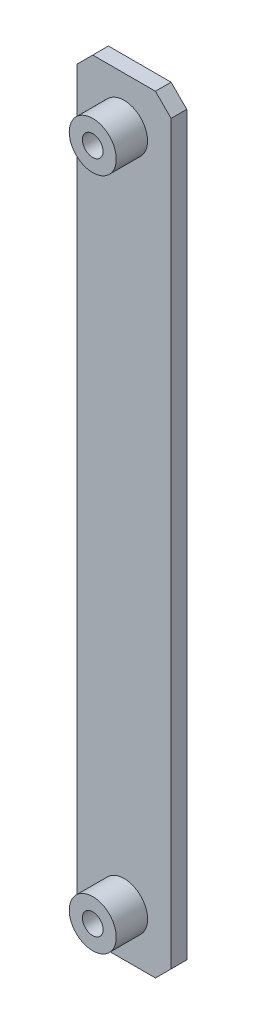
ISO-10303-21;
HEADER;
FILE_DESCRIPTION(('STEP AP214'),'2;1');
FILE_NAME('part.step','',(''),(''),'','','');
FILE_SCHEMA(('AUTOMOTIVE_DESIGN { 1 0 10303 214 1 1 1 1 }'));
ENDSEC;
DATA;
#1=APPLICATION_CONTEXT('core data for automotive mechanical design processes');
#2=APPLICATION_PROTOCOL_DEFINITION('international standard','automotive_design',2000,#1);
#3=PRODUCT_CONTEXT('',#1,'mechanical');
#4=PRODUCT('Part','Part','',(#3));
#5=PRODUCT_RELATED_PRODUCT_CATEGORY('part','',(#4));
#6=PRODUCT_DEFINITION_FORMATION('','',#4);
#7=PRODUCT_DEFINITION_CONTEXT('part definition',#1,'design');
#8=PRODUCT_DEFINITION('design','',#6,#7);
#9=PRODUCT_DEFINITION_SHAPE('','',#8);
#10=(LENGTH_UNIT() NAMED_UNIT(*) SI_UNIT(.MILLI.,.METRE.));
#11=(NAMED_UNIT(*) PLANE_ANGLE_UNIT() SI_UNIT($,.RADIAN.));
#12=(NAMED_UNIT(*) SI_UNIT($,.STERADIAN.) SOLID_ANGLE_UNIT());
#13=UNCERTAINTY_MEASURE_WITH_UNIT(LENGTH_MEASURE(1.E-05),#10,'distance_accuracy_value','');
#14=(GEOMETRIC_REPRESENTATION_CONTEXT(3) GLOBAL_UNCERTAINTY_ASSIGNED_CONTEXT((#13)) GLOBAL_UNIT_ASSIGNED_CONTEXT((#10,
#11,#12)) REPRESENTATION_CONTEXT('',''));
#15=CARTESIAN_POINT('',(0.,0.,0.));
#16=DIRECTION('',(0.,0.,1.));
#17=DIRECTION('',(1.,0.,0.));
#18=AXIS2_PLACEMENT_3D('',#15,#16,#17);
#19=CARTESIAN_POINT('',(0.,0.,1.5875));
#20=DIRECTION('',(0.,0.,1.));
#21=DIRECTION('',(1.,0.,0.));
#22=AXIS2_PLACEMENT_3D('',#19,#20,#21);
#23=PLANE('',#22);
#24=CARTESIAN_POINT('',(-4.7625,4.7625,1.5875));
#25=DIRECTION('',(0.,0.,1.));
#26=DIRECTION('',(1.,0.,0.));
#27=AXIS2_PLACEMENT_3D('',#24,#25,#26);
#28=CIRCLE('',#27,2.38125);
#29=CARTESIAN_POINT('',(-2.38125,4.7625,1.5875));
#30=VERTEX_POINT('',#29);
#31=EDGE_CURVE('E197',#30,#30,#28,.T.);
#32=ORIENTED_EDGE('',*,*,#31,.F.);
#33=EDGE_LOOP('',(#32));
#34=FACE_BOUND('',#33,.T.);
#35=DIRECTION('',(0.,1.,0.));
#36=VECTOR('',#35,1.);
#37=CARTESIAN_POINT('',(0.,0.,1.5875));
#38=LINE('',#37,#36);
#39=CARTESIAN_POINT('',(0.,1.5875,1.5875));
#40=VERTEX_POINT('',#39);
#41=CARTESIAN_POINT('',(0.,76.2,1.5875));
#42=VERTEX_POINT('',#41);
#43=EDGE_CURVE('E138',#40,#42,#38,.T.);
#44=ORIENTED_EDGE('',*,*,#43,.T.);
#45=DIRECTION('',(0.707106781186549,-0.707106781186546,0.));
#46=VECTOR('',#45,1.);
#47=CARTESIAN_POINT('',(38.1,38.1000000000002,1.5875));
#48=LINE('',#47,#46);
#49=CARTESIAN_POINT('',(-1.58750000000001,77.7875,1.5875));
#50=VERTEX_POINT('',#49);
#51=EDGE_CURVE('E153',#42,#50,#48,.F.);
#52=ORIENTED_EDGE('',*,*,#51,.T.);
#53=DIRECTION('',(-1.,0.,0.));
#54=VECTOR('',#53,1.);
#55=CARTESIAN_POINT('',(0.,77.7875,1.5875));
#56=LINE('',#55,#54);
#57=CARTESIAN_POINT('',(-7.9375,77.7875,1.5875));
#58=VERTEX_POINT('',#57);
#59=EDGE_CURVE('E121',#50,#58,#56,.T.);
#60=ORIENTED_EDGE('',*,*,#59,.T.);
#61=DIRECTION('',(0.707106781186548,0.707106781186548,0.));
#62=VECTOR('',#61,1.);
#63=CARTESIAN_POINT('',(-42.8625,42.8625,1.5875));
#64=LINE('',#63,#62);
#65=CARTESIAN_POINT('',(-9.525,76.2,1.5875));
#66=VERTEX_POINT('',#65);
#67=EDGE_CURVE('E151',#58,#66,#64,.F.);
#68=ORIENTED_EDGE('',*,*,#67,.T.);
#69=DIRECTION('',(0.,-1.,0.));
#70=VECTOR('',#69,1.);
#71=CARTESIAN_POINT('',(-9.52500000000001,0.,1.5875));
#72=LINE('',#71,#70);
#73=CARTESIAN_POINT('',(-9.52500000000001,1.58749999999998,1.5875));
#74=VERTEX_POINT('',#73);
#75=EDGE_CURVE('E173',#66,#74,#72,.T.);
#76=ORIENTED_EDGE('',*,*,#75,.T.);
#77=DIRECTION('',(-0.707106781186548,0.707106781186548,0.));
#78=VECTOR('',#77,1.);
#79=CARTESIAN_POINT('',(-3.96875000000001,-3.96875000000001,1.5875));
#80=LINE('',#79,#78);
#81=CARTESIAN_POINT('',(-7.93750000000002,0.,1.5875));
#82=VERTEX_POINT('',#81);
#83=EDGE_CURVE('E56',#74,#82,#80,.F.);
#84=ORIENTED_EDGE('',*,*,#83,.T.);
#85=DIRECTION('',(1.,0.,0.));
#86=VECTOR('',#85,1.);
#87=CARTESIAN_POINT('',(0.,0.,1.5875));
#88=LINE('',#87,#86);
#89=CARTESIAN_POINT('',(-1.58750000000001,0.,1.5875));
#90=VERTEX_POINT('',#89);
#91=EDGE_CURVE('E139',#82,#90,#88,.T.);
#92=ORIENTED_EDGE('',*,*,#91,.T.);
#93=DIRECTION('',(-0.707106781186549,-0.707106781186546,0.));
#94=VECTOR('',#93,1.);
#95=CARTESIAN_POINT('',(-0.793749999999999,0.793750000000003,1.5875));
#96=LINE('',#95,#94);
#97=EDGE_CURVE('E149',#90,#40,#96,.F.);
#98=ORIENTED_EDGE('',*,*,#97,.T.);
#99=EDGE_LOOP('',(#44,#52,#60,#68,#76,#84,#92,#98));
#100=FACE_BOUND('',#99,.T.);
#101=CARTESIAN_POINT('',(-4.7625,73.025,1.5875));
#102=DIRECTION('',(0.,0.,1.));
#103=DIRECTION('',(-1.,0.,0.));
#104=AXIS2_PLACEMENT_3D('',#101,#102,#103);
#105=CIRCLE('',#104,2.38125);
#106=CARTESIAN_POINT('',(-7.14375000000001,73.025,1.5875));
#107=VERTEX_POINT('',#106);
#108=EDGE_CURVE('E184',#107,#107,#105,.T.);
#109=ORIENTED_EDGE('',*,*,#108,.F.);
#110=EDGE_LOOP('',(#109));
#111=FACE_BOUND('',#110,.T.);
#112=ADVANCED_FACE('F35',(#34,#100,#111),#23,.T.);
#113=CARTESIAN_POINT('',(0.,0.,1.5875));
#114=DIRECTION('',(-1.,0.,0.));
#115=DIRECTION('',(0.,0.,1.));
#116=AXIS2_PLACEMENT_3D('',#113,#114,#115);
#117=PLANE('',#116);
#118=DIRECTION('',(0.,1.,0.));
#119=VECTOR('',#118,1.);
#120=CARTESIAN_POINT('',(0.,0.,0.));
#121=LINE('',#120,#119);
#122=CARTESIAN_POINT('',(0.,1.5875,0.));
#123=VERTEX_POINT('',#122);
#124=CARTESIAN_POINT('',(0.,76.2,0.));
#125=VERTEX_POINT('',#124);
#126=EDGE_CURVE('E128',#123,#125,#121,.T.);
#127=ORIENTED_EDGE('',*,*,#126,.T.);
#128=DIRECTION('',(0.,0.,1.));
#129=VECTOR('',#128,1.);
#130=CARTESIAN_POINT('',(0.,76.2,1.5875));
#131=LINE('',#130,#129);
#132=EDGE_CURVE('E106',#125,#42,#131,.T.);
#133=ORIENTED_EDGE('',*,*,#132,.T.);
#134=ORIENTED_EDGE('',*,*,#43,.F.);
#135=DIRECTION('',(0.,0.,-1.));
#136=VECTOR('',#135,1.);
#137=CARTESIAN_POINT('',(0.,1.5875,1.5875));
#138=LINE('',#137,#136);
#139=EDGE_CURVE('E111',#40,#123,#138,.T.);
#140=ORIENTED_EDGE('',*,*,#139,.T.);
#141=EDGE_LOOP('',(#127,#133,#134,#140));
#142=FACE_BOUND('',#141,.T.);
#143=ADVANCED_FACE('F170',(#142),#117,.F.);
#144=CARTESIAN_POINT('',(0.,77.7875,1.5875));
#145=DIRECTION('',(0.,-1.,0.));
#146=DIRECTION('',(1.,0.,0.));
#147=AXIS2_PLACEMENT_3D('',#144,#145,#146);
#148=PLANE('',#147);
#149=ORIENTED_EDGE('',*,*,#59,.F.);
#150=DIRECTION('',(0.,0.,-1.));
#151=VECTOR('',#150,1.);
#152=CARTESIAN_POINT('',(-1.58750000000001,77.7875,1.5875));
#153=LINE('',#152,#151);
#154=CARTESIAN_POINT('',(-1.58750000000001,77.7875,0.));
#155=VERTEX_POINT('',#154);
#156=EDGE_CURVE('E105',#50,#155,#153,.T.);
#157=ORIENTED_EDGE('',*,*,#156,.T.);
#158=DIRECTION('',(-1.,0.,0.));
#159=VECTOR('',#158,1.);
#160=CARTESIAN_POINT('',(0.,77.7875,0.));
#161=LINE('',#160,#159);
#162=CARTESIAN_POINT('',(-7.9375,77.7875,0.));
#163=VERTEX_POINT('',#162);
#164=EDGE_CURVE('E118',#155,#163,#161,.T.);
#165=ORIENTED_EDGE('',*,*,#164,.T.);
#166=DIRECTION('',(0.,0.,1.));
#167=VECTOR('',#166,1.);
#168=CARTESIAN_POINT('',(-7.93750000000001,77.7875,1.5875));
#169=LINE('',#168,#167);
#170=EDGE_CURVE('E123',#163,#58,#169,.T.);
#171=ORIENTED_EDGE('',*,*,#170,.T.);
#172=EDGE_LOOP('',(#149,#157,#165,#171));
#173=FACE_BOUND('',#172,.T.);
#174=ADVANCED_FACE('F117',(#173),#148,.F.);
#175=CARTESIAN_POINT('',(-9.52500000000001,0.,1.5875));
#176=DIRECTION('',(1.,0.,0.));
#177=DIRECTION('',(0.,1.,0.));
#178=AXIS2_PLACEMENT_3D('',#175,#176,#177);
#179=PLANE('',#178);
#180=ORIENTED_EDGE('',*,*,#75,.F.);
#181=DIRECTION('',(0.,0.,-1.));
#182=VECTOR('',#181,1.);
#183=CARTESIAN_POINT('',(-9.525,76.2,1.5875));
#184=LINE('',#183,#182);
#185=CARTESIAN_POINT('',(-9.525,76.2,0.));
#186=VERTEX_POINT('',#185);
#187=EDGE_CURVE('E157',#66,#186,#184,.T.);
#188=ORIENTED_EDGE('',*,*,#187,.T.);
#189=DIRECTION('',(0.,-1.,0.));
#190=VECTOR('',#189,1.);
#191=CARTESIAN_POINT('',(-9.52500000000001,0.,0.));
#192=LINE('',#191,#190);
#193=CARTESIAN_POINT('',(-9.52500000000001,1.58749999999998,0.));
#194=VERTEX_POINT('',#193);
#195=EDGE_CURVE('E127',#186,#194,#192,.T.);
#196=ORIENTED_EDGE('',*,*,#195,.T.);
#197=DIRECTION('',(0.,0.,1.));
#198=VECTOR('',#197,1.);
#199=CARTESIAN_POINT('',(-9.52500000000001,1.58749999999998,1.5875));
#200=LINE('',#199,#198);
#201=EDGE_CURVE('E155',#194,#74,#200,.T.);
#202=ORIENTED_EDGE('',*,*,#201,.T.);
#203=EDGE_LOOP('',(#180,#188,#196,#202));
#204=FACE_BOUND('',#203,.T.);
#205=ADVANCED_FACE('F243',(#204),#179,.F.);
#206=CARTESIAN_POINT('',(0.,0.,1.5875));
#207=DIRECTION('',(0.,1.,0.));
#208=DIRECTION('',(-1.,0.,0.));
#209=AXIS2_PLACEMENT_3D('',#206,#207,#208);
#210=PLANE('',#209);
#211=DIRECTION('',(1.,0.,0.));
#212=VECTOR('',#211,1.);
#213=CARTESIAN_POINT('',(0.,0.,0.));
#214=LINE('',#213,#212);
#215=CARTESIAN_POINT('',(-7.93750000000002,0.,0.));
#216=VERTEX_POINT('',#215);
#217=CARTESIAN_POINT('',(-1.58750000000001,0.,0.));
#218=VERTEX_POINT('',#217);
#219=EDGE_CURVE('E131',#216,#218,#214,.T.);
#220=ORIENTED_EDGE('',*,*,#219,.T.);
#221=DIRECTION('',(0.,0.,1.));
#222=VECTOR('',#221,1.);
#223=CARTESIAN_POINT('',(-1.58750000000001,0.,1.5875));
#224=LINE('',#223,#222);
#225=EDGE_CURVE('E11',#218,#90,#224,.T.);
#226=ORIENTED_EDGE('',*,*,#225,.T.);
#227=ORIENTED_EDGE('',*,*,#91,.F.);
#228=DIRECTION('',(0.,0.,-1.));
#229=VECTOR('',#228,1.);
#230=CARTESIAN_POINT('',(-7.93750000000002,0.,1.5875));
#231=LINE('',#230,#229);
#232=EDGE_CURVE('E44',#82,#216,#231,.T.);
#233=ORIENTED_EDGE('',*,*,#232,.T.);
#234=EDGE_LOOP('',(#220,#226,#227,#233));
#235=FACE_BOUND('',#234,.T.);
#236=ADVANCED_FACE('F162',(#235),#210,.F.);
#237=CARTESIAN_POINT('',(0.,0.,0.));
#238=DIRECTION('',(0.,0.,1.));
#239=DIRECTION('',(1.,0.,0.));
#240=AXIS2_PLACEMENT_3D('',#237,#238,#239);
#241=PLANE('',#240);
#242=CARTESIAN_POINT('',(-4.7625,4.7625,0.));
#243=DIRECTION('',(0.,0.,1.));
#244=DIRECTION('',(1.,0.,0.));
#245=AXIS2_PLACEMENT_3D('',#242,#243,#244);
#246=CIRCLE('',#245,1.04775);
#247=CARTESIAN_POINT('',(-3.71475,4.7625,0.));
#248=VERTEX_POINT('',#247);
#249=EDGE_CURVE('E201',#248,#248,#246,.T.);
#250=ORIENTED_EDGE('',*,*,#249,.T.);
#251=EDGE_LOOP('',(#250));
#252=FACE_BOUND('',#251,.T.);
#253=CARTESIAN_POINT('',(-4.7625,73.025,0.));
#254=DIRECTION('',(0.,0.,1.));
#255=DIRECTION('',(1.,0.,0.));
#256=AXIS2_PLACEMENT_3D('',#253,#254,#255);
#257=CIRCLE('',#256,1.04775);
#258=CARTESIAN_POINT('',(-3.71475,73.025,0.));
#259=VERTEX_POINT('',#258);
#260=EDGE_CURVE('E133',#259,#259,#257,.T.);
#261=ORIENTED_EDGE('',*,*,#260,.T.);
#262=EDGE_LOOP('',(#261));
#263=FACE_BOUND('',#262,.T.);
#264=ORIENTED_EDGE('',*,*,#164,.F.);
#265=DIRECTION('',(-0.707106781186549,0.707106781186546,0.));
#266=VECTOR('',#265,1.);
#267=CARTESIAN_POINT('',(-1.58750000000001,77.7875,0.));
#268=LINE('',#267,#266);
#269=EDGE_CURVE('E101',#155,#125,#268,.F.);
#270=ORIENTED_EDGE('',*,*,#269,.T.);
#271=ORIENTED_EDGE('',*,*,#126,.F.);
#272=DIRECTION('',(0.707106781186549,0.707106781186546,0.));
#273=VECTOR('',#272,1.);
#274=CARTESIAN_POINT('',(0.,1.5875,0.));
#275=LINE('',#274,#273);
#276=EDGE_CURVE('E142',#123,#218,#275,.F.);
#277=ORIENTED_EDGE('',*,*,#276,.T.);
#278=ORIENTED_EDGE('',*,*,#219,.F.);
#279=DIRECTION('',(0.707106781186548,-0.707106781186548,0.));
#280=VECTOR('',#279,1.);
#281=CARTESIAN_POINT('',(-7.93750000000002,0.,0.));
#282=LINE('',#281,#280);
#283=EDGE_CURVE('E122',#216,#194,#282,.F.);
#284=ORIENTED_EDGE('',*,*,#283,.T.);
#285=ORIENTED_EDGE('',*,*,#195,.F.);
#286=DIRECTION('',(-0.707106781186548,-0.707106781186548,0.));
#287=VECTOR('',#286,1.);
#288=CARTESIAN_POINT('',(-9.525,76.2,0.));
#289=LINE('',#288,#287);
#290=EDGE_CURVE('E112',#186,#163,#289,.F.);
#291=ORIENTED_EDGE('',*,*,#290,.T.);
#292=EDGE_LOOP('',(#264,#270,#271,#277,#278,#284,#285,#291));
#293=FACE_BOUND('',#292,.T.);
#294=ADVANCED_FACE('F125',(#252,#263,#293),#241,.F.);
#295=CARTESIAN_POINT('',(-1.58750000000001,77.7875,1.5875));
#296=DIRECTION('',(-0.707106781186546,-0.707106781186549,0.));
#297=DIRECTION('',(0.,0.,-1.));
#298=AXIS2_PLACEMENT_3D('',#295,#296,#297);
#299=PLANE('',#298);
#300=ORIENTED_EDGE('',*,*,#51,.F.);
#301=ORIENTED_EDGE('',*,*,#132,.F.);
#302=ORIENTED_EDGE('',*,*,#269,.F.);
#303=ORIENTED_EDGE('',*,*,#156,.F.);
#304=EDGE_LOOP('',(#300,#301,#302,#303));
#305=FACE_BOUND('',#304,.T.);
#306=ADVANCED_FACE('F104',(#305),#299,.F.);
#307=CARTESIAN_POINT('',(-9.525,76.2,1.5875));
#308=DIRECTION('',(0.707106781186548,-0.707106781186548,0.));
#309=DIRECTION('',(0.,0.,-1.));
#310=AXIS2_PLACEMENT_3D('',#307,#308,#309);
#311=PLANE('',#310);
#312=ORIENTED_EDGE('',*,*,#67,.F.);
#313=ORIENTED_EDGE('',*,*,#170,.F.);
#314=ORIENTED_EDGE('',*,*,#290,.F.);
#315=ORIENTED_EDGE('',*,*,#187,.F.);
#316=EDGE_LOOP('',(#312,#313,#314,#315));
#317=FACE_BOUND('',#316,.T.);
#318=ADVANCED_FACE('F257',(#317),#311,.F.);
#319=CARTESIAN_POINT('',(0.,1.5875,1.5875));
#320=DIRECTION('',(-0.707106781186546,0.707106781186549,0.));
#321=DIRECTION('',(0.,0.,-1.));
#322=AXIS2_PLACEMENT_3D('',#319,#320,#321);
#323=PLANE('',#322);
#324=ORIENTED_EDGE('',*,*,#97,.F.);
#325=ORIENTED_EDGE('',*,*,#225,.F.);
#326=ORIENTED_EDGE('',*,*,#276,.F.);
#327=ORIENTED_EDGE('',*,*,#139,.F.);
#328=EDGE_LOOP('',(#324,#325,#326,#327));
#329=FACE_BOUND('',#328,.T.);
#330=ADVANCED_FACE('F167',(#329),#323,.F.);
#331=CARTESIAN_POINT('',(-7.93750000000002,0.,1.5875));
#332=DIRECTION('',(0.707106781186548,0.707106781186548,0.));
#333=DIRECTION('',(0.,0.,-1.));
#334=AXIS2_PLACEMENT_3D('',#331,#332,#333);
#335=PLANE('',#334);
#336=ORIENTED_EDGE('',*,*,#83,.F.);
#337=ORIENTED_EDGE('',*,*,#201,.F.);
#338=ORIENTED_EDGE('',*,*,#283,.F.);
#339=ORIENTED_EDGE('',*,*,#232,.F.);
#340=EDGE_LOOP('',(#336,#337,#338,#339));
#341=FACE_BOUND('',#340,.T.);
#342=ADVANCED_FACE('F38',(#341),#335,.F.);
#343=CARTESIAN_POINT('',(-4.7625,73.025,1.5875));
#344=DIRECTION('',(0.,0.,1.));
#345=DIRECTION('',(1.,0.,0.));
#346=AXIS2_PLACEMENT_3D('',#343,#344,#345);
#347=CYLINDRICAL_SURFACE('',#346,1.04775);
#348=ORIENTED_EDGE('',*,*,#260,.F.);
#349=EDGE_LOOP('',(#348));
#350=FACE_BOUND('',#349,.T.);
#351=CARTESIAN_POINT('',(-4.7625,73.025,4.7625));
#352=DIRECTION('',(0.,0.,1.));
#353=DIRECTION('',(-1.,0.,0.));
#354=AXIS2_PLACEMENT_3D('',#351,#352,#353);
#355=CIRCLE('',#354,1.04775);
#356=CARTESIAN_POINT('',(-5.81025,73.025,4.7625));
#357=VERTEX_POINT('',#356);
#358=EDGE_CURVE('E187',#357,#357,#355,.T.);
#359=ORIENTED_EDGE('',*,*,#358,.T.);
#360=EDGE_LOOP('',(#359));
#361=FACE_BOUND('',#360,.T.);
#362=ADVANCED_FACE('F210',(#350,#361),#347,.F.);
#363=CARTESIAN_POINT('',(-4.7625,4.7625,1.5875));
#364=DIRECTION('',(0.,0.,1.));
#365=DIRECTION('',(1.,0.,0.));
#366=AXIS2_PLACEMENT_3D('',#363,#364,#365);
#367=CYLINDRICAL_SURFACE('',#366,1.04775);
#368=ORIENTED_EDGE('',*,*,#249,.F.);
#369=EDGE_LOOP('',(#368));
#370=FACE_BOUND('',#369,.T.);
#371=CARTESIAN_POINT('',(-4.7625,4.7625,4.7625));
#372=DIRECTION('',(0.,0.,1.));
#373=DIRECTION('',(1.,0.,0.));
#374=AXIS2_PLACEMENT_3D('',#371,#372,#373);
#375=CIRCLE('',#374,1.04775);
#376=CARTESIAN_POINT('',(-3.71475,4.7625,4.7625));
#377=VERTEX_POINT('',#376);
#378=EDGE_CURVE('E190',#377,#377,#375,.T.);
#379=ORIENTED_EDGE('',*,*,#378,.T.);
#380=EDGE_LOOP('',(#379));
#381=FACE_BOUND('',#380,.T.);
#382=ADVANCED_FACE('F213',(#370,#381),#367,.F.);
#383=CARTESIAN_POINT('',(-4.7625,4.7625,4.7625));
#384=DIRECTION('',(0.,0.,1.));
#385=DIRECTION('',(1.,0.,0.));
#386=AXIS2_PLACEMENT_3D('',#383,#384,#385);
#387=PLANE('',#386);
#388=CARTESIAN_POINT('',(-4.7625,4.7625,4.7625));
#389=DIRECTION('',(0.,0.,1.));
#390=DIRECTION('',(1.,0.,0.));
#391=AXIS2_PLACEMENT_3D('',#388,#389,#390);
#392=CIRCLE('',#391,2.38125);
#393=CARTESIAN_POINT('',(-2.38125,4.7625,4.7625));
#394=VERTEX_POINT('',#393);
#395=EDGE_CURVE('E198',#394,#394,#392,.T.);
#396=ORIENTED_EDGE('',*,*,#395,.T.);
#397=EDGE_LOOP('',(#396));
#398=FACE_BOUND('',#397,.T.);
#399=ORIENTED_EDGE('',*,*,#378,.F.);
#400=EDGE_LOOP('',(#399));
#401=FACE_BOUND('',#400,.T.);
#402=ADVANCED_FACE('F229',(#398,#401),#387,.T.);
#403=CARTESIAN_POINT('',(-4.7625,4.7625,4.7625));
#404=DIRECTION('',(0.,0.,-1.));
#405=DIRECTION('',(-1.,0.,0.));
#406=AXIS2_PLACEMENT_3D('',#403,#404,#405);
#407=CYLINDRICAL_SURFACE('',#406,2.38125);
#408=ORIENTED_EDGE('',*,*,#395,.F.);
#409=EDGE_LOOP('',(#408));
#410=FACE_BOUND('',#409,.T.);
#411=ORIENTED_EDGE('',*,*,#31,.T.);
#412=EDGE_LOOP('',(#411));
#413=FACE_BOUND('',#412,.T.);
#414=ADVANCED_FACE('F220',(#410,#413),#407,.T.);
#415=CARTESIAN_POINT('',(-4.7625,73.025,4.7625));
#416=DIRECTION('',(0.,0.,-1.));
#417=DIRECTION('',(-1.,0.,0.));
#418=AXIS2_PLACEMENT_3D('',#415,#416,#417);
#419=PLANE('',#418);
#420=CARTESIAN_POINT('',(-4.7625,73.025,4.7625));
#421=DIRECTION('',(0.,0.,1.));
#422=DIRECTION('',(-1.,0.,0.));
#423=AXIS2_PLACEMENT_3D('',#420,#421,#422);
#424=CIRCLE('',#423,2.38125);
#425=CARTESIAN_POINT('',(-7.14375000000001,73.025,4.7625));
#426=VERTEX_POINT('',#425);
#427=EDGE_CURVE('E186',#426,#426,#424,.T.);
#428=ORIENTED_EDGE('',*,*,#427,.T.);
#429=EDGE_LOOP('',(#428));
#430=FACE_BOUND('',#429,.T.);
#431=ORIENTED_EDGE('',*,*,#358,.F.);
#432=EDGE_LOOP('',(#431));
#433=FACE_BOUND('',#432,.T.);
#434=ADVANCED_FACE('F217',(#430,#433),#419,.F.);
#435=CARTESIAN_POINT('',(-4.7625,73.025,4.7625));
#436=DIRECTION('',(0.,0.,-1.));
#437=DIRECTION('',(-1.,0.,0.));
#438=AXIS2_PLACEMENT_3D('',#435,#436,#437);
#439=CYLINDRICAL_SURFACE('',#438,2.38125);
#440=ORIENTED_EDGE('',*,*,#427,.F.);
#441=EDGE_LOOP('',(#440));
#442=FACE_BOUND('',#441,.T.);
#443=ORIENTED_EDGE('',*,*,#108,.T.);
#444=EDGE_LOOP('',(#443));
#445=FACE_BOUND('',#444,.T.);
#446=ADVANCED_FACE('F219',(#442,#445),#439,.T.);
#447=CLOSED_SHELL('',(#112,#143,#174,#205,#236,#294,#306,#318,#330,#342,#362,#382,#402,#414,
#434,#446));
#448=MANIFOLD_SOLID_BREP('B2',#447);
#449=ADVANCED_BREP_SHAPE_REPRESENTATION('',(#18,#448),#14);
#450=SHAPE_DEFINITION_REPRESENTATION(#9,#449);
ENDSEC;
END-ISO-10303-21;
